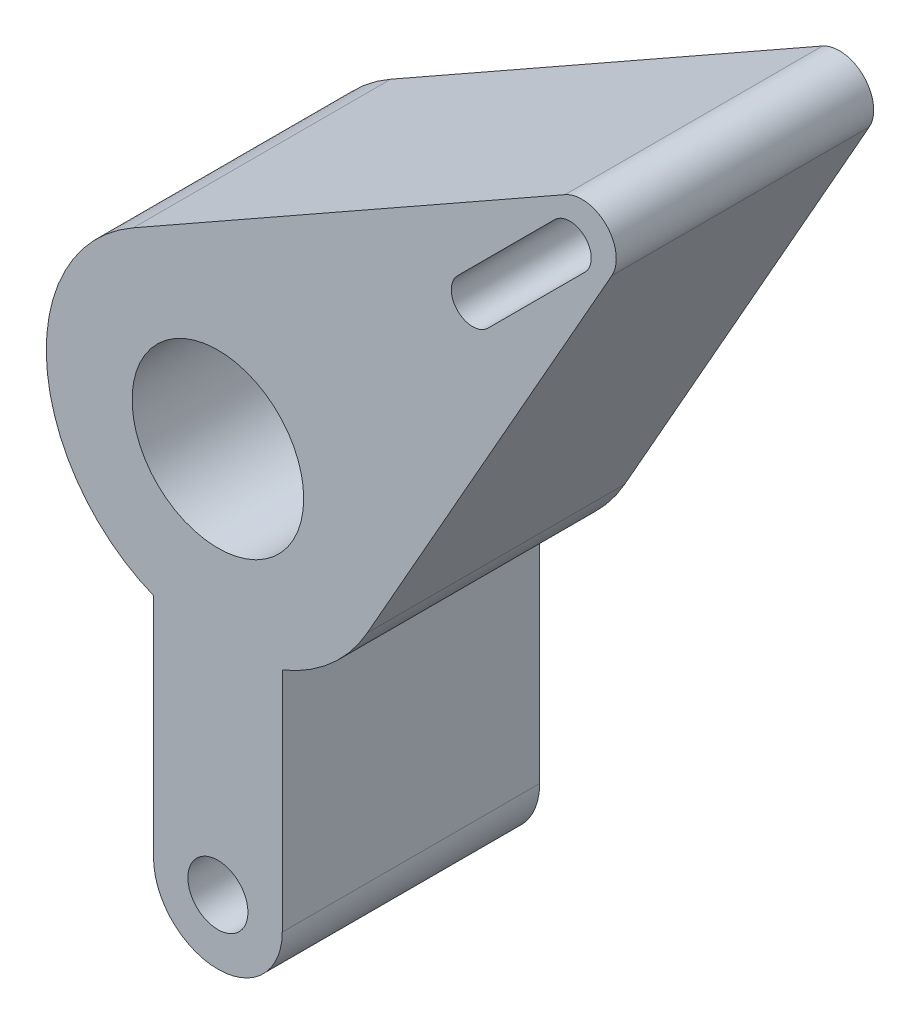
ISO-10303-21;
HEADER;
FILE_DESCRIPTION(('STEP AP214'),'2;1');
FILE_NAME('part.step','',(''),(''),'','','');
FILE_SCHEMA(('AUTOMOTIVE_DESIGN { 1 0 10303 214 1 1 1 1 }'));
ENDSEC;
DATA;
#1=APPLICATION_CONTEXT('core data for automotive mechanical design processes');
#2=APPLICATION_PROTOCOL_DEFINITION('international standard','automotive_design',2000,#1);
#3=PRODUCT_CONTEXT('',#1,'mechanical');
#4=PRODUCT('Part','Part','',(#3));
#5=PRODUCT_RELATED_PRODUCT_CATEGORY('part','',(#4));
#6=PRODUCT_DEFINITION_FORMATION('','',#4);
#7=PRODUCT_DEFINITION_CONTEXT('part definition',#1,'design');
#8=PRODUCT_DEFINITION('design','',#6,#7);
#9=PRODUCT_DEFINITION_SHAPE('','',#8);
#10=(LENGTH_UNIT() NAMED_UNIT(*) SI_UNIT(.MILLI.,.METRE.));
#11=(NAMED_UNIT(*) PLANE_ANGLE_UNIT() SI_UNIT($,.RADIAN.));
#12=(NAMED_UNIT(*) SI_UNIT($,.STERADIAN.) SOLID_ANGLE_UNIT());
#13=UNCERTAINTY_MEASURE_WITH_UNIT(LENGTH_MEASURE(1.E-05),#10,'distance_accuracy_value','');
#14=(GEOMETRIC_REPRESENTATION_CONTEXT(3) GLOBAL_UNCERTAINTY_ASSIGNED_CONTEXT((#13)) GLOBAL_UNIT_ASSIGNED_CONTEXT((#10,
#11,#12)) REPRESENTATION_CONTEXT('',''));
#15=CARTESIAN_POINT('',(0.,0.,0.));
#16=DIRECTION('',(0.,0.,1.));
#17=DIRECTION('',(1.,0.,0.));
#18=AXIS2_PLACEMENT_3D('',#15,#16,#17);
#19=CARTESIAN_POINT('',(0.,0.,30.));
#20=DIRECTION('',(0.,0.,-1.));
#21=DIRECTION('',(-1.,0.,0.));
#22=AXIS2_PLACEMENT_3D('',#19,#20,#21);
#23=CYLINDRICAL_SURFACE('',#22,20.);
#24=CARTESIAN_POINT('',(0.,0.,0.));
#25=DIRECTION('',(0.,0.,1.));
#26=DIRECTION('',(1.,0.,0.));
#27=AXIS2_PLACEMENT_3D('',#24,#25,#26);
#28=CIRCLE('',#27,20.);
#29=CARTESIAN_POINT('',(-9.85879603384557,17.4012683665022,0.));
#30=VERTEX_POINT('',#29);
#31=CARTESIAN_POINT('',(-7.5,-18.5404962177392,0.));
#32=VERTEX_POINT('',#31);
#33=EDGE_CURVE('E166',#30,#32,#28,.T.);
#34=ORIENTED_EDGE('',*,*,#33,.T.);
#35=DIRECTION('',(0.,0.,-1.));
#36=VECTOR('',#35,1.);
#37=CARTESIAN_POINT('',(-7.5,-18.5404962177392,30.));
#38=LINE('',#37,#36);
#39=CARTESIAN_POINT('',(-7.5,-18.5404962177392,30.));
#40=VERTEX_POINT('',#39);
#41=EDGE_CURVE('E11',#40,#32,#38,.T.);
#42=ORIENTED_EDGE('',*,*,#41,.F.);
#43=CARTESIAN_POINT('',(0.,0.,30.));
#44=DIRECTION('',(0.,0.,1.));
#45=DIRECTION('',(1.,0.,0.));
#46=AXIS2_PLACEMENT_3D('',#43,#44,#45);
#47=CIRCLE('',#46,20.);
#48=CARTESIAN_POINT('',(-9.85879603384557,17.4012683665022,30.));
#49=VERTEX_POINT('',#48);
#50=EDGE_CURVE('E169',#49,#40,#47,.T.);
#51=ORIENTED_EDGE('',*,*,#50,.F.);
#52=DIRECTION('',(0.,0.,-1.));
#53=VECTOR('',#52,1.);
#54=CARTESIAN_POINT('',(-9.85879603384557,17.4012683665022,30.));
#55=LINE('',#54,#53);
#56=EDGE_CURVE('E192',#49,#30,#55,.T.);
#57=ORIENTED_EDGE('',*,*,#56,.T.);
#58=EDGE_LOOP('',(#34,#42,#51,#57));
#59=FACE_BOUND('',#58,.T.);
#60=ADVANCED_FACE('F37',(#59),#23,.T.);
#61=CARTESIAN_POINT('',(-7.5,0.,30.));
#62=DIRECTION('',(1.,0.,0.));
#63=DIRECTION('',(0.,1.,0.));
#64=AXIS2_PLACEMENT_3D('',#61,#62,#63);
#65=PLANE('',#64);
#66=DIRECTION('',(0.,-1.,0.));
#67=VECTOR('',#66,1.);
#68=CARTESIAN_POINT('',(-7.5,0.,0.));
#69=LINE('',#68,#67);
#70=CARTESIAN_POINT('',(-7.50000000000001,-45.,0.));
#71=VERTEX_POINT('',#70);
#72=EDGE_CURVE('E195',#32,#71,#69,.T.);
#73=ORIENTED_EDGE('',*,*,#72,.T.);
#74=DIRECTION('',(0.,0.,-1.));
#75=VECTOR('',#74,1.);
#76=CARTESIAN_POINT('',(-7.50000000000001,-45.,30.));
#77=LINE('',#76,#75);
#78=CARTESIAN_POINT('',(-7.50000000000001,-45.,30.));
#79=VERTEX_POINT('',#78);
#80=EDGE_CURVE('E45',#79,#71,#77,.T.);
#81=ORIENTED_EDGE('',*,*,#80,.F.);
#82=DIRECTION('',(0.,-1.,0.));
#83=VECTOR('',#82,1.);
#84=CARTESIAN_POINT('',(-7.5,0.,30.));
#85=LINE('',#84,#83);
#86=EDGE_CURVE('E172',#40,#79,#85,.T.);
#87=ORIENTED_EDGE('',*,*,#86,.F.);
#88=ORIENTED_EDGE('',*,*,#41,.T.);
#89=EDGE_LOOP('',(#73,#81,#87,#88));
#90=FACE_BOUND('',#89,.T.);
#91=ADVANCED_FACE('F39',(#90),#65,.F.);
#92=CARTESIAN_POINT('',(0.,-45.,30.));
#93=DIRECTION('',(0.,0.,-1.));
#94=DIRECTION('',(-1.,0.,0.));
#95=AXIS2_PLACEMENT_3D('',#92,#93,#94);
#96=CYLINDRICAL_SURFACE('',#95,7.5);
#97=CARTESIAN_POINT('',(0.,-45.,0.));
#98=DIRECTION('',(0.,0.,1.));
#99=DIRECTION('',(1.,0.,0.));
#100=AXIS2_PLACEMENT_3D('',#97,#98,#99);
#101=CIRCLE('',#100,7.5);
#102=CARTESIAN_POINT('',(7.49999999999999,-45.,0.));
#103=VERTEX_POINT('',#102);
#104=EDGE_CURVE('E198',#71,#103,#101,.T.);
#105=ORIENTED_EDGE('',*,*,#104,.T.);
#106=DIRECTION('',(0.,0.,-1.));
#107=VECTOR('',#106,1.);
#108=CARTESIAN_POINT('',(7.49999999999999,-45.,30.));
#109=LINE('',#108,#107);
#110=CARTESIAN_POINT('',(7.49999999999999,-45.,30.));
#111=VERTEX_POINT('',#110);
#112=EDGE_CURVE('E224',#111,#103,#109,.T.);
#113=ORIENTED_EDGE('',*,*,#112,.F.);
#114=CARTESIAN_POINT('',(0.,-45.,30.));
#115=DIRECTION('',(0.,0.,1.));
#116=DIRECTION('',(1.,0.,0.));
#117=AXIS2_PLACEMENT_3D('',#114,#115,#116);
#118=CIRCLE('',#117,7.5);
#119=EDGE_CURVE('E176',#79,#111,#118,.T.);
#120=ORIENTED_EDGE('',*,*,#119,.F.);
#121=ORIENTED_EDGE('',*,*,#80,.T.);
#122=EDGE_LOOP('',(#105,#113,#120,#121));
#123=FACE_BOUND('',#122,.T.);
#124=ADVANCED_FACE('F230',(#123),#96,.T.);
#125=CARTESIAN_POINT('',(7.5,0.,30.));
#126=DIRECTION('',(1.,0.,0.));
#127=DIRECTION('',(0.,1.,0.));
#128=AXIS2_PLACEMENT_3D('',#125,#126,#127);
#129=PLANE('',#128);
#130=DIRECTION('',(0.,-1.,0.));
#131=VECTOR('',#130,1.);
#132=CARTESIAN_POINT('',(7.5,0.,0.));
#133=LINE('',#132,#131);
#134=CARTESIAN_POINT('',(7.5,-18.5404962177392,0.));
#135=VERTEX_POINT('',#134);
#136=EDGE_CURVE('E201',#135,#103,#133,.T.);
#137=ORIENTED_EDGE('',*,*,#136,.F.);
#138=DIRECTION('',(0.,0.,-1.));
#139=VECTOR('',#138,1.);
#140=CARTESIAN_POINT('',(7.5,-18.5404962177392,30.));
#141=LINE('',#140,#139);
#142=CARTESIAN_POINT('',(7.5,-18.5404962177392,30.));
#143=VERTEX_POINT('',#142);
#144=EDGE_CURVE('E222',#143,#135,#141,.T.);
#145=ORIENTED_EDGE('',*,*,#144,.F.);
#146=DIRECTION('',(0.,-1.,0.));
#147=VECTOR('',#146,1.);
#148=CARTESIAN_POINT('',(7.5,0.,30.));
#149=LINE('',#148,#147);
#150=EDGE_CURVE('E178',#143,#111,#149,.T.);
#151=ORIENTED_EDGE('',*,*,#150,.T.);
#152=ORIENTED_EDGE('',*,*,#112,.T.);
#153=EDGE_LOOP('',(#137,#145,#151,#152));
#154=FACE_BOUND('',#153,.T.);
#155=ADVANCED_FACE('F240',(#154),#129,.T.);
#156=CARTESIAN_POINT('',(17.4012683665021,-9.85879603384575,0.));
#157=VERTEX_POINT('',#156);
#158=EDGE_CURVE('E196',#135,#157,#28,.T.);
#159=ORIENTED_EDGE('',*,*,#158,.T.);
#160=DIRECTION('',(0.,0.,-1.));
#161=VECTOR('',#160,1.);
#162=CARTESIAN_POINT('',(17.4012683665021,-9.85879603384575,30.));
#163=LINE('',#162,#161);
#164=CARTESIAN_POINT('',(17.4012683665021,-9.85879603384575,30.));
#165=VERTEX_POINT('',#164);
#166=EDGE_CURVE('E220',#165,#157,#163,.T.);
#167=ORIENTED_EDGE('',*,*,#166,.F.);
#168=EDGE_CURVE('E174',#143,#165,#47,.T.);
#169=ORIENTED_EDGE('',*,*,#168,.F.);
#170=ORIENTED_EDGE('',*,*,#144,.T.);
#171=EDGE_LOOP('',(#159,#167,#169,#170));
#172=FACE_BOUND('',#171,.T.);
#173=ADVANCED_FACE('F264',(#172),#23,.T.);
#174=CARTESIAN_POINT('',(17.4012683665021,-9.85879603384575,30.));
#175=DIRECTION('',(0.870063418325106,-0.492939801692287,0.));
#176=DIRECTION('',(0.492939801692287,0.870063418325106,0.));
#177=AXIS2_PLACEMENT_3D('',#174,#175,#176);
#178=PLANE('',#177);
#179=DIRECTION('',(-0.492939801692287,-0.870063418325106,0.));
#180=VECTOR('',#179,1.);
#181=CARTESIAN_POINT('',(17.4012683665021,-9.85879603384575,0.));
#182=LINE('',#181,#180);
#183=CARTESIAN_POINT('',(45.9066605444935,40.4546476644235,0.));
#184=VERTEX_POINT('',#183);
#185=EDGE_CURVE('E204',#184,#157,#182,.T.);
#186=ORIENTED_EDGE('',*,*,#185,.F.);
#187=DIRECTION('',(0.,0.,-1.));
#188=VECTOR('',#187,1.);
#189=CARTESIAN_POINT('',(45.9066605444935,40.4546476644235,30.));
#190=LINE('',#189,#188);
#191=CARTESIAN_POINT('',(45.9066605444935,40.4546476644235,30.));
#192=VERTEX_POINT('',#191);
#193=EDGE_CURVE('E218',#192,#184,#190,.T.);
#194=ORIENTED_EDGE('',*,*,#193,.F.);
#195=DIRECTION('',(-0.492939801692287,-0.870063418325106,0.));
#196=VECTOR('',#195,1.);
#197=CARTESIAN_POINT('',(17.4012683665021,-9.85879603384575,30.));
#198=LINE('',#197,#196);
#199=EDGE_CURVE('E181',#192,#165,#198,.T.);
#200=ORIENTED_EDGE('',*,*,#199,.T.);
#201=ORIENTED_EDGE('',*,*,#166,.T.);
#202=EDGE_LOOP('',(#186,#194,#200,#201));
#203=FACE_BOUND('',#202,.T.);
#204=ADVANCED_FACE('F262',(#203),#178,.T.);
#205=CARTESIAN_POINT('',(42.4264068711931,42.4264068711926,30.));
#206=DIRECTION('',(0.,0.,-1.));
#207=DIRECTION('',(-1.,0.,0.));
#208=AXIS2_PLACEMENT_3D('',#205,#206,#207);
#209=CYLINDRICAL_SURFACE('',#208,4.00000000000001);
#210=CARTESIAN_POINT('',(42.4264068711931,42.4264068711926,0.));
#211=DIRECTION('',(0.,0.,1.));
#212=DIRECTION('',(1.,0.,0.));
#213=AXIS2_PLACEMENT_3D('',#210,#211,#212);
#214=CIRCLE('',#213,4.00000000000001);
#215=CARTESIAN_POINT('',(40.454647664424,45.9066605444931,0.));
#216=VERTEX_POINT('',#215);
#217=EDGE_CURVE('E207',#184,#216,#214,.T.);
#218=ORIENTED_EDGE('',*,*,#217,.T.);
#219=DIRECTION('',(0.,0.,-1.));
#220=VECTOR('',#219,1.);
#221=CARTESIAN_POINT('',(40.454647664424,45.9066605444931,30.));
#222=LINE('',#221,#220);
#223=CARTESIAN_POINT('',(40.454647664424,45.9066605444931,30.));
#224=VERTEX_POINT('',#223);
#225=EDGE_CURVE('E216',#224,#216,#222,.T.);
#226=ORIENTED_EDGE('',*,*,#225,.F.);
#227=CARTESIAN_POINT('',(42.4264068711931,42.4264068711926,30.));
#228=DIRECTION('',(0.,0.,1.));
#229=DIRECTION('',(1.,0.,0.));
#230=AXIS2_PLACEMENT_3D('',#227,#228,#229);
#231=CIRCLE('',#230,4.00000000000001);
#232=EDGE_CURVE('E184',#192,#224,#231,.T.);
#233=ORIENTED_EDGE('',*,*,#232,.F.);
#234=ORIENTED_EDGE('',*,*,#193,.T.);
#235=EDGE_LOOP('',(#218,#226,#233,#234));
#236=FACE_BOUND('',#235,.T.);
#237=ADVANCED_FACE('F259',(#236),#209,.T.);
#238=CARTESIAN_POINT('',(-9.85879603384558,17.4012683665022,30.));
#239=DIRECTION('',(-0.492939801692279,0.870063418325111,0.));
#240=DIRECTION('',(-0.870063418325111,-0.492939801692279,0.));
#241=AXIS2_PLACEMENT_3D('',#238,#239,#240);
#242=PLANE('',#241);
#243=DIRECTION('',(0.870063418325111,0.492939801692279,0.));
#244=VECTOR('',#243,1.);
#245=CARTESIAN_POINT('',(-9.85879603384558,17.4012683665022,0.));
#246=LINE('',#245,#244);
#247=EDGE_CURVE('E210',#30,#216,#246,.T.);
#248=ORIENTED_EDGE('',*,*,#247,.F.);
#249=ORIENTED_EDGE('',*,*,#56,.F.);
#250=DIRECTION('',(0.870063418325111,0.492939801692279,0.));
#251=VECTOR('',#250,1.);
#252=CARTESIAN_POINT('',(-9.85879603384558,17.4012683665022,30.));
#253=LINE('',#252,#251);
#254=EDGE_CURVE('E186',#49,#224,#253,.T.);
#255=ORIENTED_EDGE('',*,*,#254,.T.);
#256=ORIENTED_EDGE('',*,*,#225,.T.);
#257=EDGE_LOOP('',(#248,#249,#255,#256));
#258=FACE_BOUND('',#257,.T.);
#259=ADVANCED_FACE('F255',(#258),#242,.T.);
#260=CARTESIAN_POINT('',(0.,-45.,30.));
#261=DIRECTION('',(0.,0.,-1.));
#262=DIRECTION('',(-1.,0.,0.));
#263=AXIS2_PLACEMENT_3D('',#260,#261,#262);
#264=CYLINDRICAL_SURFACE('',#263,3.5);
#265=CARTESIAN_POINT('',(0.,-45.,30.));
#266=DIRECTION('',(0.,0.,1.));
#267=DIRECTION('',(1.,0.,0.));
#268=AXIS2_PLACEMENT_3D('',#265,#266,#267);
#269=CIRCLE('',#268,3.5);
#270=CARTESIAN_POINT('',(3.5,-45.,30.));
#271=VERTEX_POINT('',#270);
#272=EDGE_CURVE('E189',#271,#271,#269,.T.);
#273=ORIENTED_EDGE('',*,*,#272,.T.);
#274=EDGE_LOOP('',(#273));
#275=FACE_BOUND('',#274,.T.);
#276=CARTESIAN_POINT('',(0.,-45.,0.));
#277=DIRECTION('',(0.,0.,1.));
#278=DIRECTION('',(1.,0.,0.));
#279=AXIS2_PLACEMENT_3D('',#276,#277,#278);
#280=CIRCLE('',#279,3.5);
#281=CARTESIAN_POINT('',(3.5,-45.,0.));
#282=VERTEX_POINT('',#281);
#283=EDGE_CURVE('E173',#282,#282,#280,.T.);
#284=ORIENTED_EDGE('',*,*,#283,.F.);
#285=EDGE_LOOP('',(#284));
#286=FACE_BOUND('',#285,.T.);
#287=ADVANCED_FACE('F313',(#275,#286),#264,.F.);
#288=CARTESIAN_POINT('',(0.,0.,30.));
#289=DIRECTION('',(0.,0.,1.));
#290=DIRECTION('',(1.,0.,0.));
#291=AXIS2_PLACEMENT_3D('',#288,#289,#290);
#292=PLANE('',#291);
#293=CARTESIAN_POINT('',(29.6984848098351,29.6984848098348,30.));
#294=DIRECTION('',(0.,0.,1.));
#295=DIRECTION('',(1.,0.,0.));
#296=AXIS2_PLACEMENT_3D('',#293,#294,#295);
#297=CIRCLE('',#296,2.5);
#298=CARTESIAN_POINT('',(27.9307178568688,31.4662517628012,30.));
#299=VERTEX_POINT('',#298);
#300=CARTESIAN_POINT('',(31.4662517628015,27.9307178568685,30.));
#301=VERTEX_POINT('',#300);
#302=EDGE_CURVE('E52',#299,#301,#297,.T.);
#303=ORIENTED_EDGE('',*,*,#302,.F.);
#304=DIRECTION('',(-0.707106781186551,-0.707106781186544,0.));
#305=VECTOR('',#304,1.);
#306=CARTESIAN_POINT('',(27.9307178568688,31.4662517628012,30.));
#307=LINE('',#306,#305);
#308=CARTESIAN_POINT('',(39.2444263558536,42.7799602617859,30.));
#309=VERTEX_POINT('',#308);
#310=EDGE_CURVE('E144',#309,#299,#307,.T.);
#311=ORIENTED_EDGE('',*,*,#310,.F.);
#312=CARTESIAN_POINT('',(41.01219330882,41.0121933088195,30.));
#313=DIRECTION('',(0.,0.,1.));
#314=DIRECTION('',(1.,0.,0.));
#315=AXIS2_PLACEMENT_3D('',#312,#313,#314);
#316=CIRCLE('',#315,2.5);
#317=CARTESIAN_POINT('',(42.7799602617863,39.2444263558532,30.));
#318=VERTEX_POINT('',#317);
#319=EDGE_CURVE('E147',#318,#309,#316,.T.);
#320=ORIENTED_EDGE('',*,*,#319,.F.);
#321=DIRECTION('',(0.707106781186551,0.707106781186544,0.));
#322=VECTOR('',#321,1.);
#323=CARTESIAN_POINT('',(31.4662517628015,27.9307178568685,30.));
#324=LINE('',#323,#322);
#325=EDGE_CURVE('E153',#301,#318,#324,.T.);
#326=ORIENTED_EDGE('',*,*,#325,.F.);
#327=EDGE_LOOP('',(#303,#311,#320,#326));
#328=FACE_BOUND('',#327,.T.);
#329=CARTESIAN_POINT('',(0.,0.,30.));
#330=DIRECTION('',(0.,0.,1.));
#331=DIRECTION('',(1.,0.,0.));
#332=AXIS2_PLACEMENT_3D('',#329,#330,#331);
#333=CIRCLE('',#332,10.);
#334=CARTESIAN_POINT('',(10.,0.,30.));
#335=VERTEX_POINT('',#334);
#336=EDGE_CURVE('E159',#335,#335,#333,.T.);
#337=ORIENTED_EDGE('',*,*,#336,.F.);
#338=EDGE_LOOP('',(#337));
#339=FACE_BOUND('',#338,.T.);
#340=ORIENTED_EDGE('',*,*,#50,.T.);
#341=ORIENTED_EDGE('',*,*,#86,.T.);
#342=ORIENTED_EDGE('',*,*,#119,.T.);
#343=ORIENTED_EDGE('',*,*,#150,.F.);
#344=ORIENTED_EDGE('',*,*,#168,.T.);
#345=ORIENTED_EDGE('',*,*,#199,.F.);
#346=ORIENTED_EDGE('',*,*,#232,.T.);
#347=ORIENTED_EDGE('',*,*,#254,.F.);
#348=EDGE_LOOP('',(#340,#341,#342,#343,#344,#345,#346,#347));
#349=FACE_BOUND('',#348,.T.);
#350=ORIENTED_EDGE('',*,*,#272,.F.);
#351=EDGE_LOOP('',(#350));
#352=FACE_BOUND('',#351,.T.);
#353=ADVANCED_FACE('F244',(#328,#339,#349,#352),#292,.T.);
#354=CARTESIAN_POINT('',(0.,0.,0.));
#355=DIRECTION('',(0.,0.,1.));
#356=DIRECTION('',(1.,0.,0.));
#357=AXIS2_PLACEMENT_3D('',#354,#355,#356);
#358=PLANE('',#357);
#359=DIRECTION('',(-0.707106781186551,-0.707106781186544,0.));
#360=VECTOR('',#359,1.);
#361=CARTESIAN_POINT('',(27.9307178568688,31.4662517628012,0.));
#362=LINE('',#361,#360);
#363=CARTESIAN_POINT('',(39.2444263558536,42.7799602617859,0.));
#364=VERTEX_POINT('',#363);
#365=CARTESIAN_POINT('',(27.9307178568688,31.4662517628012,0.));
#366=VERTEX_POINT('',#365);
#367=EDGE_CURVE('E134',#364,#366,#362,.T.);
#368=ORIENTED_EDGE('',*,*,#367,.T.);
#369=CARTESIAN_POINT('',(29.6984848098351,29.6984848098348,0.));
#370=DIRECTION('',(0.,0.,1.));
#371=DIRECTION('',(1.,0.,0.));
#372=AXIS2_PLACEMENT_3D('',#369,#370,#371);
#373=CIRCLE('',#372,2.5);
#374=CARTESIAN_POINT('',(31.4662517628015,27.9307178568685,0.));
#375=VERTEX_POINT('',#374);
#376=EDGE_CURVE('E128',#366,#375,#373,.T.);
#377=ORIENTED_EDGE('',*,*,#376,.T.);
#378=DIRECTION('',(0.707106781186551,0.707106781186544,0.));
#379=VECTOR('',#378,1.);
#380=CARTESIAN_POINT('',(31.4662517628015,27.9307178568685,0.));
#381=LINE('',#380,#379);
#382=CARTESIAN_POINT('',(42.7799602617863,39.2444263558532,0.));
#383=VERTEX_POINT('',#382);
#384=EDGE_CURVE('E137',#375,#383,#381,.T.);
#385=ORIENTED_EDGE('',*,*,#384,.T.);
#386=CARTESIAN_POINT('',(41.01219330882,41.0121933088195,0.));
#387=DIRECTION('',(0.,0.,1.));
#388=DIRECTION('',(1.,0.,0.));
#389=AXIS2_PLACEMENT_3D('',#386,#387,#388);
#390=CIRCLE('',#389,2.5);
#391=EDGE_CURVE('E60',#383,#364,#390,.T.);
#392=ORIENTED_EDGE('',*,*,#391,.T.);
#393=EDGE_LOOP('',(#368,#377,#385,#392));
#394=FACE_BOUND('',#393,.T.);
#395=CARTESIAN_POINT('',(0.,0.,0.));
#396=DIRECTION('',(0.,0.,1.));
#397=DIRECTION('',(1.,0.,0.));
#398=AXIS2_PLACEMENT_3D('',#395,#396,#397);
#399=CIRCLE('',#398,10.);
#400=CARTESIAN_POINT('',(10.,0.,0.));
#401=VERTEX_POINT('',#400);
#402=EDGE_CURVE('E163',#401,#401,#399,.T.);
#403=ORIENTED_EDGE('',*,*,#402,.T.);
#404=EDGE_LOOP('',(#403));
#405=FACE_BOUND('',#404,.T.);
#406=ORIENTED_EDGE('',*,*,#33,.F.);
#407=ORIENTED_EDGE('',*,*,#247,.T.);
#408=ORIENTED_EDGE('',*,*,#217,.F.);
#409=ORIENTED_EDGE('',*,*,#185,.T.);
#410=ORIENTED_EDGE('',*,*,#158,.F.);
#411=ORIENTED_EDGE('',*,*,#136,.T.);
#412=ORIENTED_EDGE('',*,*,#104,.F.);
#413=ORIENTED_EDGE('',*,*,#72,.F.);
#414=EDGE_LOOP('',(#406,#407,#408,#409,#410,#411,#412,#413));
#415=FACE_BOUND('',#414,.T.);
#416=ORIENTED_EDGE('',*,*,#283,.T.);
#417=EDGE_LOOP('',(#416));
#418=FACE_BOUND('',#417,.T.);
#419=ADVANCED_FACE('F141',(#394,#405,#415,#418),#358,.F.);
#420=CARTESIAN_POINT('',(0.,0.,0.));
#421=DIRECTION('',(0.,0.,1.));
#422=DIRECTION('',(1.,0.,0.));
#423=AXIS2_PLACEMENT_3D('',#420,#421,#422);
#424=CYLINDRICAL_SURFACE('',#423,10.);
#425=ORIENTED_EDGE('',*,*,#402,.F.);
#426=EDGE_LOOP('',(#425));
#427=FACE_BOUND('',#426,.T.);
#428=ORIENTED_EDGE('',*,*,#336,.T.);
#429=EDGE_LOOP('',(#428));
#430=FACE_BOUND('',#429,.T.);
#431=ADVANCED_FACE('F343',(#427,#430),#424,.F.);
#432=CARTESIAN_POINT('',(29.6984848098351,29.6984848098348,0.));
#433=DIRECTION('',(0.,0.,1.));
#434=DIRECTION('',(1.,0.,0.));
#435=AXIS2_PLACEMENT_3D('',#432,#433,#434);
#436=CYLINDRICAL_SURFACE('',#435,2.5);
#437=ORIENTED_EDGE('',*,*,#302,.T.);
#438=DIRECTION('',(0.,0.,1.));
#439=VECTOR('',#438,1.);
#440=CARTESIAN_POINT('',(31.4662517628015,27.9307178568685,0.));
#441=LINE('',#440,#439);
#442=EDGE_CURVE('E124',#375,#301,#441,.T.);
#443=ORIENTED_EDGE('',*,*,#442,.F.);
#444=ORIENTED_EDGE('',*,*,#376,.F.);
#445=DIRECTION('',(0.,0.,1.));
#446=VECTOR('',#445,1.);
#447=CARTESIAN_POINT('',(27.9307178568688,31.4662517628012,0.));
#448=LINE('',#447,#446);
#449=EDGE_CURVE('E157',#366,#299,#448,.T.);
#450=ORIENTED_EDGE('',*,*,#449,.T.);
#451=EDGE_LOOP('',(#437,#443,#444,#450));
#452=FACE_BOUND('',#451,.T.);
#453=ADVANCED_FACE('F126',(#452),#436,.F.);
#454=CARTESIAN_POINT('',(27.9307178568688,31.4662517628012,0.));
#455=DIRECTION('',(-0.707106781186544,0.707106781186551,0.));
#456=DIRECTION('',(-0.707106781186551,-0.707106781186544,0.));
#457=AXIS2_PLACEMENT_3D('',#454,#455,#456);
#458=PLANE('',#457);
#459=ORIENTED_EDGE('',*,*,#310,.T.);
#460=ORIENTED_EDGE('',*,*,#449,.F.);
#461=ORIENTED_EDGE('',*,*,#367,.F.);
#462=DIRECTION('',(0.,0.,1.));
#463=VECTOR('',#462,1.);
#464=CARTESIAN_POINT('',(39.2444263558536,42.7799602617859,0.));
#465=LINE('',#464,#463);
#466=EDGE_CURVE('E160',#364,#309,#465,.T.);
#467=ORIENTED_EDGE('',*,*,#466,.T.);
#468=EDGE_LOOP('',(#459,#460,#461,#467));
#469=FACE_BOUND('',#468,.T.);
#470=ADVANCED_FACE('F362',(#469),#458,.F.);
#471=CARTESIAN_POINT('',(41.01219330882,41.0121933088195,0.));
#472=DIRECTION('',(0.,0.,1.));
#473=DIRECTION('',(1.,0.,0.));
#474=AXIS2_PLACEMENT_3D('',#471,#472,#473);
#475=CYLINDRICAL_SURFACE('',#474,2.5);
#476=ORIENTED_EDGE('',*,*,#319,.T.);
#477=ORIENTED_EDGE('',*,*,#466,.F.);
#478=ORIENTED_EDGE('',*,*,#391,.F.);
#479=DIRECTION('',(0.,0.,1.));
#480=VECTOR('',#479,1.);
#481=CARTESIAN_POINT('',(42.7799602617863,39.2444263558532,0.));
#482=LINE('',#481,#480);
#483=EDGE_CURVE('E133',#383,#318,#482,.T.);
#484=ORIENTED_EDGE('',*,*,#483,.T.);
#485=EDGE_LOOP('',(#476,#477,#478,#484));
#486=FACE_BOUND('',#485,.T.);
#487=ADVANCED_FACE('F371',(#486),#475,.F.);
#488=CARTESIAN_POINT('',(31.4662517628015,27.9307178568685,0.));
#489=DIRECTION('',(0.707106781186544,-0.707106781186551,0.));
#490=DIRECTION('',(0.707106781186551,0.707106781186544,0.));
#491=AXIS2_PLACEMENT_3D('',#488,#489,#490);
#492=PLANE('',#491);
#493=ORIENTED_EDGE('',*,*,#325,.T.);
#494=ORIENTED_EDGE('',*,*,#483,.F.);
#495=ORIENTED_EDGE('',*,*,#384,.F.);
#496=ORIENTED_EDGE('',*,*,#442,.T.);
#497=EDGE_LOOP('',(#493,#494,#495,#496));
#498=FACE_BOUND('',#497,.T.);
#499=ADVANCED_FACE('F138',(#498),#492,.F.);
#500=CLOSED_SHELL('',(#60,#91,#124,#155,#173,#204,#237,#259,#287,#353,#419,#431,#453,#470,#487,#499));
#501=MANIFOLD_SOLID_BREP('B2',#500);
#502=ADVANCED_BREP_SHAPE_REPRESENTATION('',(#18,#501),#14);
#503=SHAPE_DEFINITION_REPRESENTATION(#9,#502);
ENDSEC;
END-ISO-10303-21;
